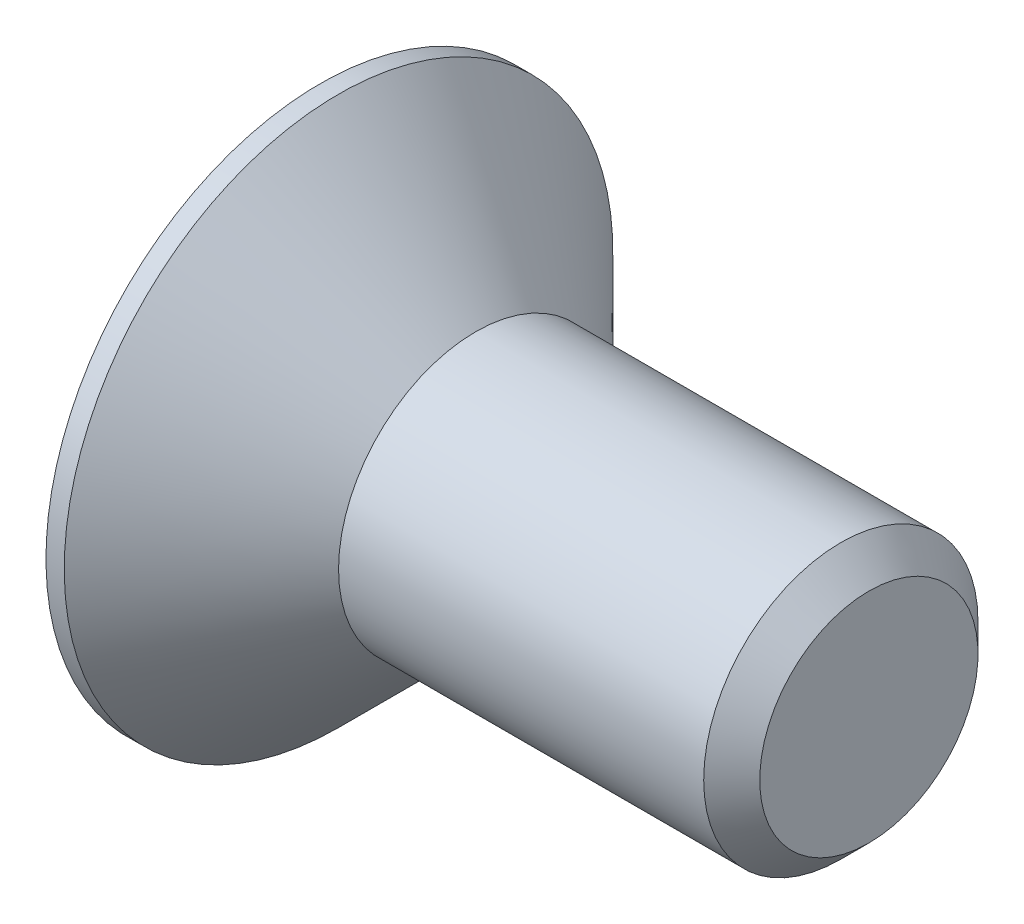
ISO-10303-21;
HEADER;
FILE_DESCRIPTION(('STEP AP214'),'2;1');
FILE_NAME('part.step','',(''),(''),'','','');
FILE_SCHEMA(('AUTOMOTIVE_DESIGN { 1 0 10303 214 1 1 1 1 }'));
ENDSEC;
DATA;
#1=APPLICATION_CONTEXT('core data for automotive mechanical design processes');
#2=APPLICATION_PROTOCOL_DEFINITION('international standard','automotive_design',2000,#1);
#3=PRODUCT_CONTEXT('',#1,'mechanical');
#4=PRODUCT('Part','Part','',(#3));
#5=PRODUCT_RELATED_PRODUCT_CATEGORY('part','',(#4));
#6=PRODUCT_DEFINITION_FORMATION('','',#4);
#7=PRODUCT_DEFINITION_CONTEXT('part definition',#1,'design');
#8=PRODUCT_DEFINITION('design','',#6,#7);
#9=PRODUCT_DEFINITION_SHAPE('','',#8);
#10=(LENGTH_UNIT() NAMED_UNIT(*) SI_UNIT(.MILLI.,.METRE.));
#11=(NAMED_UNIT(*) PLANE_ANGLE_UNIT() SI_UNIT($,.RADIAN.));
#12=(NAMED_UNIT(*) SI_UNIT($,.STERADIAN.) SOLID_ANGLE_UNIT());
#13=UNCERTAINTY_MEASURE_WITH_UNIT(LENGTH_MEASURE(1.E-05),#10,'distance_accuracy_value','');
#14=(GEOMETRIC_REPRESENTATION_CONTEXT(3) GLOBAL_UNCERTAINTY_ASSIGNED_CONTEXT((#13)) GLOBAL_UNIT_ASSIGNED_CONTEXT((#10,
#11,#12)) REPRESENTATION_CONTEXT('',''));
#15=CARTESIAN_POINT('',(0.,0.,0.));
#16=DIRECTION('',(0.,0.,1.));
#17=DIRECTION('',(1.,0.,0.));
#18=AXIS2_PLACEMENT_3D('',#15,#16,#17);
#19=CARTESIAN_POINT('',(-1.7,0.,0.));
#20=DIRECTION('',(1.,0.,0.));
#21=DIRECTION('',(0.,1.,0.));
#22=AXIS2_PLACEMENT_3D('',#19,#20,#21);
#23=PLANE('',#22);
#24=CARTESIAN_POINT('',(-1.7,0.,0.));
#25=DIRECTION('',(-1.,0.,0.));
#26=DIRECTION('',(0.,-1.,0.));
#27=AXIS2_PLACEMENT_3D('',#24,#25,#26);
#28=CIRCLE('',#27,3.);
#29=CARTESIAN_POINT('',(-1.7,-3.,0.));
#30=VERTEX_POINT('',#29);
#31=EDGE_CURVE('E11',#30,#30,#28,.T.);
#32=ORIENTED_EDGE('',*,*,#31,.T.);
#33=EDGE_LOOP('',(#32));
#34=FACE_BOUND('',#33,.T.);
#35=DIRECTION('',(0.,-0.500000000000029,-0.866025403784422));
#36=VECTOR('',#35,1.);
#37=CARTESIAN_POINT('',(-1.7,-0.57735026918963,1.));
#38=LINE('',#37,#36);
#39=CARTESIAN_POINT('',(-1.7,-0.57735026918963,1.));
#40=VERTEX_POINT('',#39);
#41=CARTESIAN_POINT('',(-1.7,-1.1547005383793,0.));
#42=VERTEX_POINT('',#41);
#43=EDGE_CURVE('E177',#40,#42,#38,.T.);
#44=ORIENTED_EDGE('',*,*,#43,.T.);
#45=DIRECTION('',(0.,0.500000000000029,-0.866025403784422));
#46=VECTOR('',#45,1.);
#47=CARTESIAN_POINT('',(-1.7,-1.1547005383793,0.));
#48=LINE('',#47,#46);
#49=CARTESIAN_POINT('',(-1.7,-0.57735026918963,-1.));
#50=VERTEX_POINT('',#49);
#51=EDGE_CURVE('E180',#42,#50,#48,.T.);
#52=ORIENTED_EDGE('',*,*,#51,.T.);
#53=DIRECTION('',(0.,1.,0.));
#54=VECTOR('',#53,1.);
#55=CARTESIAN_POINT('',(-1.7,-0.57735026918963,-1.));
#56=LINE('',#55,#54);
#57=CARTESIAN_POINT('',(-1.7,0.57735026918963,-1.));
#58=VERTEX_POINT('',#57);
#59=EDGE_CURVE('E192',#50,#58,#56,.T.);
#60=ORIENTED_EDGE('',*,*,#59,.T.);
#61=DIRECTION('',(0.,0.500000000000029,0.866025403784422));
#62=VECTOR('',#61,1.);
#63=CARTESIAN_POINT('',(-1.7,0.57735026918963,-1.));
#64=LINE('',#63,#62);
#65=CARTESIAN_POINT('',(-1.7,1.1547005383793,0.));
#66=VERTEX_POINT('',#65);
#67=EDGE_CURVE('E100',#58,#66,#64,.T.);
#68=ORIENTED_EDGE('',*,*,#67,.T.);
#69=DIRECTION('',(0.,-0.500000000000029,0.866025403784422));
#70=VECTOR('',#69,1.);
#71=CARTESIAN_POINT('',(-1.7,1.1547005383793,0.));
#72=LINE('',#71,#70);
#73=CARTESIAN_POINT('',(-1.7,0.57735026918963,1.));
#74=VERTEX_POINT('',#73);
#75=EDGE_CURVE('E216',#66,#74,#72,.T.);
#76=ORIENTED_EDGE('',*,*,#75,.T.);
#77=DIRECTION('',(0.,-1.,0.));
#78=VECTOR('',#77,1.);
#79=CARTESIAN_POINT('',(-1.7,0.57735026918963,1.));
#80=LINE('',#79,#78);
#81=EDGE_CURVE('E115',#74,#40,#80,.T.);
#82=ORIENTED_EDGE('',*,*,#81,.T.);
#83=EDGE_LOOP('',(#44,#52,#60,#68,#76,#82));
#84=FACE_BOUND('',#83,.T.);
#85=ADVANCED_FACE('F17',(#34,#84),#23,.F.);
#86=CARTESIAN_POINT('',(4.3,0.,0.));
#87=DIRECTION('',(-1.,0.,0.));
#88=DIRECTION('',(0.,-1.,0.));
#89=AXIS2_PLACEMENT_3D('',#86,#87,#88);
#90=CYLINDRICAL_SURFACE('',#89,3.);
#91=ORIENTED_EDGE('',*,*,#31,.F.);
#92=EDGE_LOOP('',(#91));
#93=FACE_BOUND('',#92,.T.);
#94=CARTESIAN_POINT('',(-1.5,0.,0.));
#95=DIRECTION('',(-1.,0.,0.));
#96=DIRECTION('',(0.,-1.,0.));
#97=AXIS2_PLACEMENT_3D('',#94,#95,#96);
#98=CIRCLE('',#97,3.);
#99=CARTESIAN_POINT('',(-1.5,-3.,0.));
#100=VERTEX_POINT('',#99);
#101=EDGE_CURVE('E24',#100,#100,#98,.T.);
#102=ORIENTED_EDGE('',*,*,#101,.T.);
#103=EDGE_LOOP('',(#102));
#104=FACE_BOUND('',#103,.T.);
#105=ADVANCED_FACE('F137',(#93,#104),#90,.T.);
#106=CARTESIAN_POINT('',(0.,0.,0.));
#107=DIRECTION('',(-1.,0.,0.));
#108=DIRECTION('',(0.,-1.,0.));
#109=AXIS2_PLACEMENT_3D('',#106,#107,#108);
#110=CONICAL_SURFACE('',#109,1.5,0.785398163397449);
#111=ORIENTED_EDGE('',*,*,#101,.F.);
#112=EDGE_LOOP('',(#111));
#113=FACE_BOUND('',#112,.T.);
#114=CARTESIAN_POINT('',(0.,0.,0.));
#115=DIRECTION('',(-1.,0.,0.));
#116=DIRECTION('',(0.,-1.,0.));
#117=AXIS2_PLACEMENT_3D('',#114,#115,#116);
#118=CIRCLE('',#117,1.5);
#119=CARTESIAN_POINT('',(0.,-1.5,0.));
#120=VERTEX_POINT('',#119);
#121=EDGE_CURVE('E132',#120,#120,#118,.T.);
#122=ORIENTED_EDGE('',*,*,#121,.T.);
#123=EDGE_LOOP('',(#122));
#124=FACE_BOUND('',#123,.T.);
#125=ADVANCED_FACE('F139',(#113,#124),#110,.T.);
#126=CARTESIAN_POINT('',(4.3,0.,0.));
#127=DIRECTION('',(-1.,0.,0.));
#128=DIRECTION('',(0.,-1.,0.));
#129=AXIS2_PLACEMENT_3D('',#126,#127,#128);
#130=CYLINDRICAL_SURFACE('',#129,1.5);
#131=ORIENTED_EDGE('',*,*,#121,.F.);
#132=EDGE_LOOP('',(#131));
#133=FACE_BOUND('',#132,.T.);
#134=CARTESIAN_POINT('',(3.9935,0.,0.));
#135=DIRECTION('',(-1.,0.,0.));
#136=DIRECTION('',(0.,-1.,0.));
#137=AXIS2_PLACEMENT_3D('',#134,#135,#136);
#138=CIRCLE('',#137,1.5);
#139=CARTESIAN_POINT('',(3.9935,-1.5,0.));
#140=VERTEX_POINT('',#139);
#141=EDGE_CURVE('E129',#140,#140,#138,.T.);
#142=ORIENTED_EDGE('',*,*,#141,.T.);
#143=EDGE_LOOP('',(#142));
#144=FACE_BOUND('',#143,.T.);
#145=ADVANCED_FACE('F142',(#133,#144),#130,.T.);
#146=CARTESIAN_POINT('',(4.3,0.,0.));
#147=DIRECTION('',(-1.,0.,0.));
#148=DIRECTION('',(0.,-1.,0.));
#149=AXIS2_PLACEMENT_3D('',#146,#147,#148);
#150=CONICAL_SURFACE('',#149,1.1935,0.785398163397446);
#151=ORIENTED_EDGE('',*,*,#141,.F.);
#152=EDGE_LOOP('',(#151));
#153=FACE_BOUND('',#152,.T.);
#154=CARTESIAN_POINT('',(4.3,0.,0.));
#155=DIRECTION('',(-1.,0.,0.));
#156=DIRECTION('',(0.,-1.,0.));
#157=AXIS2_PLACEMENT_3D('',#154,#155,#156);
#158=CIRCLE('',#157,1.1935);
#159=CARTESIAN_POINT('',(4.3,-1.1935,0.));
#160=VERTEX_POINT('',#159);
#161=EDGE_CURVE('E125',#160,#160,#158,.T.);
#162=ORIENTED_EDGE('',*,*,#161,.T.);
#163=EDGE_LOOP('',(#162));
#164=FACE_BOUND('',#163,.T.);
#165=ADVANCED_FACE('F148',(#153,#164),#150,.T.);
#166=CARTESIAN_POINT('',(4.3,1.1935,0.));
#167=DIRECTION('',(-1.,0.,0.));
#168=DIRECTION('',(0.,-1.,0.));
#169=AXIS2_PLACEMENT_3D('',#166,#167,#168);
#170=PLANE('',#169);
#171=ORIENTED_EDGE('',*,*,#161,.F.);
#172=EDGE_LOOP('',(#171));
#173=FACE_BOUND('',#172,.T.);
#174=ADVANCED_FACE('F154',(#173),#170,.F.);
#175=CARTESIAN_POINT('',(-0.85,1.1547005383793,0.));
#176=DIRECTION('',(0.,-0.866025403784422,-0.500000000000029));
#177=DIRECTION('',(0.,0.500000000000029,-0.866025403784422));
#178=AXIS2_PLACEMENT_3D('',#175,#176,#177);
#179=PLANE('',#178);
#180=DIRECTION('',(0.,-0.500000000000029,0.866025403784422));
#181=VECTOR('',#180,1.);
#182=CARTESIAN_POINT('',(-0.85,1.1547005383793,0.));
#183=LINE('',#182,#181);
#184=CARTESIAN_POINT('',(-0.85,1.1547005383793,0.));
#185=VERTEX_POINT('',#184);
#186=CARTESIAN_POINT('',(-0.85,0.866025403784442,0.50000000000004));
#187=VERTEX_POINT('',#186);
#188=EDGE_CURVE('E97',#185,#187,#183,.T.);
#189=ORIENTED_EDGE('',*,*,#188,.T.);
#190=CARTESIAN_POINT('',(-0.85,0.57735026918963,1.));
#191=VERTEX_POINT('',#190);
#192=EDGE_CURVE('E89',#187,#191,#183,.T.);
#193=ORIENTED_EDGE('',*,*,#192,.T.);
#194=DIRECTION('',(-1.,0.,0.));
#195=VECTOR('',#194,1.);
#196=CARTESIAN_POINT('',(-0.85,0.57735026918963,1.));
#197=LINE('',#196,#195);
#198=EDGE_CURVE('E94',#191,#74,#197,.T.);
#199=ORIENTED_EDGE('',*,*,#198,.T.);
#200=ORIENTED_EDGE('',*,*,#75,.F.);
#201=DIRECTION('',(-1.,0.,0.));
#202=VECTOR('',#201,1.);
#203=CARTESIAN_POINT('',(-0.85,1.1547005383793,0.));
#204=LINE('',#203,#202);
#205=EDGE_CURVE('E198',#185,#66,#204,.T.);
#206=ORIENTED_EDGE('',*,*,#205,.F.);
#207=EDGE_LOOP('',(#189,#193,#199,#200,#206));
#208=FACE_BOUND('',#207,.T.);
#209=ADVANCED_FACE('F91',(#208),#179,.T.);
#210=CARTESIAN_POINT('',(-0.85,0.57735026918963,1.));
#211=DIRECTION('',(0.,0.,-1.));
#212=DIRECTION('',(-1.,0.,0.));
#213=AXIS2_PLACEMENT_3D('',#210,#211,#212);
#214=PLANE('',#213);
#215=DIRECTION('',(0.,-1.,0.));
#216=VECTOR('',#215,1.);
#217=CARTESIAN_POINT('',(-0.85,0.57735026918963,1.));
#218=LINE('',#217,#216);
#219=CARTESIAN_POINT('',(-0.85,0.,1.));
#220=VERTEX_POINT('',#219);
#221=EDGE_CURVE('E103',#191,#220,#218,.T.);
#222=ORIENTED_EDGE('',*,*,#221,.T.);
#223=CARTESIAN_POINT('',(-0.85,-0.57735026918963,1.));
#224=VERTEX_POINT('',#223);
#225=EDGE_CURVE('E110',#220,#224,#218,.T.);
#226=ORIENTED_EDGE('',*,*,#225,.T.);
#227=DIRECTION('',(-1.,0.,0.));
#228=VECTOR('',#227,1.);
#229=CARTESIAN_POINT('',(-0.85,-0.57735026918963,1.));
#230=LINE('',#229,#228);
#231=EDGE_CURVE('E117',#224,#40,#230,.T.);
#232=ORIENTED_EDGE('',*,*,#231,.T.);
#233=ORIENTED_EDGE('',*,*,#81,.F.);
#234=ORIENTED_EDGE('',*,*,#198,.F.);
#235=EDGE_LOOP('',(#222,#226,#232,#233,#234));
#236=FACE_BOUND('',#235,.T.);
#237=ADVANCED_FACE('F113',(#236),#214,.T.);
#238=CARTESIAN_POINT('',(-0.85,-0.57735026918963,1.));
#239=DIRECTION('',(0.,0.866025403784422,-0.500000000000029));
#240=DIRECTION('',(0.,0.500000000000029,0.866025403784422));
#241=AXIS2_PLACEMENT_3D('',#238,#239,#240);
#242=PLANE('',#241);
#243=DIRECTION('',(0.,-0.500000000000029,-0.866025403784422));
#244=VECTOR('',#243,1.);
#245=CARTESIAN_POINT('',(-0.85,-0.57735026918963,1.));
#246=LINE('',#245,#244);
#247=CARTESIAN_POINT('',(-0.85,-0.866025403784442,0.50000000000004));
#248=VERTEX_POINT('',#247);
#249=EDGE_CURVE('E225',#224,#248,#246,.T.);
#250=ORIENTED_EDGE('',*,*,#249,.T.);
#251=CARTESIAN_POINT('',(-0.85,-1.1547005383793,0.));
#252=VERTEX_POINT('',#251);
#253=EDGE_CURVE('E109',#248,#252,#246,.T.);
#254=ORIENTED_EDGE('',*,*,#253,.T.);
#255=DIRECTION('',(-1.,0.,0.));
#256=VECTOR('',#255,1.);
#257=CARTESIAN_POINT('',(-0.85,-1.1547005383793,0.));
#258=LINE('',#257,#256);
#259=EDGE_CURVE('E121',#252,#42,#258,.T.);
#260=ORIENTED_EDGE('',*,*,#259,.T.);
#261=ORIENTED_EDGE('',*,*,#43,.F.);
#262=ORIENTED_EDGE('',*,*,#231,.F.);
#263=EDGE_LOOP('',(#250,#254,#260,#261,#262));
#264=FACE_BOUND('',#263,.T.);
#265=ADVANCED_FACE('F186',(#264),#242,.T.);
#266=CARTESIAN_POINT('',(-0.85,-1.1547005383793,0.));
#267=DIRECTION('',(0.,0.866025403784422,0.500000000000029));
#268=DIRECTION('',(0.,-0.500000000000029,0.866025403784422));
#269=AXIS2_PLACEMENT_3D('',#266,#267,#268);
#270=PLANE('',#269);
#271=DIRECTION('',(0.,0.500000000000029,-0.866025403784422));
#272=VECTOR('',#271,1.);
#273=CARTESIAN_POINT('',(-0.85,-1.1547005383793,0.));
#274=LINE('',#273,#272);
#275=CARTESIAN_POINT('',(-0.85,-0.866025403784422,-0.500000000000029));
#276=VERTEX_POINT('',#275);
#277=EDGE_CURVE('E31',#252,#276,#274,.T.);
#278=ORIENTED_EDGE('',*,*,#277,.T.);
#279=CARTESIAN_POINT('',(-0.85,-0.57735026918963,-1.));
#280=VERTEX_POINT('',#279);
#281=EDGE_CURVE('E224',#276,#280,#274,.T.);
#282=ORIENTED_EDGE('',*,*,#281,.T.);
#283=DIRECTION('',(-1.,0.,0.));
#284=VECTOR('',#283,1.);
#285=CARTESIAN_POINT('',(-0.85,-0.57735026918963,-1.));
#286=LINE('',#285,#284);
#287=EDGE_CURVE('E188',#280,#50,#286,.T.);
#288=ORIENTED_EDGE('',*,*,#287,.T.);
#289=ORIENTED_EDGE('',*,*,#51,.F.);
#290=ORIENTED_EDGE('',*,*,#259,.F.);
#291=EDGE_LOOP('',(#278,#282,#288,#289,#290));
#292=FACE_BOUND('',#291,.T.);
#293=ADVANCED_FACE('F189',(#292),#270,.T.);
#294=CARTESIAN_POINT('',(-0.85,-0.57735026918963,-1.));
#295=DIRECTION('',(0.,0.,1.));
#296=DIRECTION('',(1.,0.,0.));
#297=AXIS2_PLACEMENT_3D('',#294,#295,#296);
#298=PLANE('',#297);
#299=DIRECTION('',(0.,1.,0.));
#300=VECTOR('',#299,1.);
#301=CARTESIAN_POINT('',(-0.85,-0.57735026918963,-1.));
#302=LINE('',#301,#300);
#303=CARTESIAN_POINT('',(-0.85,0.,-1.));
#304=VERTEX_POINT('',#303);
#305=EDGE_CURVE('E221',#280,#304,#302,.T.);
#306=ORIENTED_EDGE('',*,*,#305,.T.);
#307=CARTESIAN_POINT('',(-0.85,0.57735026918963,-1.));
#308=VERTEX_POINT('',#307);
#309=EDGE_CURVE('E211',#304,#308,#302,.T.);
#310=ORIENTED_EDGE('',*,*,#309,.T.);
#311=DIRECTION('',(-1.,0.,0.));
#312=VECTOR('',#311,1.);
#313=CARTESIAN_POINT('',(-0.85,0.57735026918963,-1.));
#314=LINE('',#313,#312);
#315=EDGE_CURVE('E201',#308,#58,#314,.T.);
#316=ORIENTED_EDGE('',*,*,#315,.T.);
#317=ORIENTED_EDGE('',*,*,#59,.F.);
#318=ORIENTED_EDGE('',*,*,#287,.F.);
#319=EDGE_LOOP('',(#306,#310,#316,#317,#318));
#320=FACE_BOUND('',#319,.T.);
#321=ADVANCED_FACE('F209',(#320),#298,.T.);
#322=CARTESIAN_POINT('',(-0.85,0.57735026918963,-1.));
#323=DIRECTION('',(0.,-0.866025403784422,0.500000000000029));
#324=DIRECTION('',(0.,-0.500000000000029,-0.866025403784422));
#325=AXIS2_PLACEMENT_3D('',#322,#323,#324);
#326=PLANE('',#325);
#327=DIRECTION('',(0.,0.500000000000029,0.866025403784422));
#328=VECTOR('',#327,1.);
#329=CARTESIAN_POINT('',(-0.85,0.57735026918963,-1.));
#330=LINE('',#329,#328);
#331=CARTESIAN_POINT('',(-0.85,0.866025403784442,-0.50000000000004));
#332=VERTEX_POINT('',#331);
#333=EDGE_CURVE('E202',#308,#332,#330,.T.);
#334=ORIENTED_EDGE('',*,*,#333,.T.);
#335=EDGE_CURVE('E220',#332,#185,#330,.T.);
#336=ORIENTED_EDGE('',*,*,#335,.T.);
#337=ORIENTED_EDGE('',*,*,#205,.T.);
#338=ORIENTED_EDGE('',*,*,#67,.F.);
#339=ORIENTED_EDGE('',*,*,#315,.F.);
#340=EDGE_LOOP('',(#334,#336,#337,#338,#339));
#341=FACE_BOUND('',#340,.T.);
#342=ADVANCED_FACE('F215',(#341),#326,.T.);
#343=CARTESIAN_POINT('',(-0.85,0.57735026918963,1.));
#344=DIRECTION('',(1.,0.,0.));
#345=DIRECTION('',(0.,0.,-1.));
#346=AXIS2_PLACEMENT_3D('',#343,#344,#345);
#347=PLANE('',#346);
#348=CARTESIAN_POINT('',(-0.85,0.,0.));
#349=DIRECTION('',(-1.,0.,0.));
#350=DIRECTION('',(0.,0.,1.));
#351=AXIS2_PLACEMENT_3D('',#348,#349,#350);
#352=CIRCLE('',#351,1.);
#353=EDGE_CURVE('E239',#332,#304,#352,.T.);
#354=ORIENTED_EDGE('',*,*,#353,.F.);
#355=ORIENTED_EDGE('',*,*,#333,.F.);
#356=ORIENTED_EDGE('',*,*,#309,.F.);
#357=EDGE_LOOP('',(#354,#355,#356));
#358=FACE_BOUND('',#357,.T.);
#359=ADVANCED_FACE('F246',(#358),#347,.F.);
#360=EDGE_CURVE('E126',#187,#332,#352,.T.);
#361=ORIENTED_EDGE('',*,*,#360,.F.);
#362=ORIENTED_EDGE('',*,*,#188,.F.);
#363=ORIENTED_EDGE('',*,*,#335,.F.);
#364=EDGE_LOOP('',(#361,#362,#363));
#365=FACE_BOUND('',#364,.T.);
#366=ADVANCED_FACE('F244',(#365),#347,.F.);
#367=EDGE_CURVE('E105',#220,#187,#352,.T.);
#368=ORIENTED_EDGE('',*,*,#367,.F.);
#369=ORIENTED_EDGE('',*,*,#221,.F.);
#370=ORIENTED_EDGE('',*,*,#192,.F.);
#371=EDGE_LOOP('',(#368,#369,#370));
#372=FACE_BOUND('',#371,.T.);
#373=ADVANCED_FACE('F104',(#372),#347,.F.);
#374=EDGE_CURVE('E116',#248,#220,#352,.T.);
#375=ORIENTED_EDGE('',*,*,#374,.F.);
#376=ORIENTED_EDGE('',*,*,#249,.F.);
#377=ORIENTED_EDGE('',*,*,#225,.F.);
#378=EDGE_LOOP('',(#375,#376,#377));
#379=FACE_BOUND('',#378,.T.);
#380=ADVANCED_FACE('F229',(#379),#347,.F.);
#381=EDGE_CURVE('E119',#276,#248,#352,.T.);
#382=ORIENTED_EDGE('',*,*,#381,.F.);
#383=ORIENTED_EDGE('',*,*,#277,.F.);
#384=ORIENTED_EDGE('',*,*,#253,.F.);
#385=EDGE_LOOP('',(#382,#383,#384));
#386=FACE_BOUND('',#385,.T.);
#387=ADVANCED_FACE('F233',(#386),#347,.F.);
#388=EDGE_CURVE('E235',#304,#276,#352,.T.);
#389=ORIENTED_EDGE('',*,*,#388,.F.);
#390=ORIENTED_EDGE('',*,*,#305,.F.);
#391=ORIENTED_EDGE('',*,*,#281,.F.);
#392=EDGE_LOOP('',(#389,#390,#391));
#393=FACE_BOUND('',#392,.T.);
#394=ADVANCED_FACE('F247',(#393),#347,.F.);
#395=CARTESIAN_POINT('',(-0.58205080756888,0.,0.));
#396=DIRECTION('',(-1.,0.,0.));
#397=DIRECTION('',(0.,0.,1.));
#398=AXIS2_PLACEMENT_3D('',#395,#396,#397);
#399=CONICAL_SURFACE('',#398,0.,1.30899693899575);
#400=ORIENTED_EDGE('',*,*,#367,.T.);
#401=ORIENTED_EDGE('',*,*,#360,.T.);
#402=ORIENTED_EDGE('',*,*,#353,.T.);
#403=ORIENTED_EDGE('',*,*,#388,.T.);
#404=ORIENTED_EDGE('',*,*,#381,.T.);
#405=ORIENTED_EDGE('',*,*,#374,.T.);
#406=EDGE_LOOP('',(#400,#401,#402,#403,#404,#405));
#407=FACE_BOUND('',#406,.T.);
#408=CARTESIAN_POINT('',(-0.58205080756888,0.,0.));
#409=VERTEX_POINT('',#408);
#410=VERTEX_LOOP('',#409);
#411=FACE_BOUND('',#410,.T.);
#412=ADVANCED_FACE('F237',(#407,#411),#399,.F.);
#413=CLOSED_SHELL('',(#85,#105,#125,#145,#165,#174,#209,#237,#265,#293,#321,#342,#359,#366,#373,
#380,#387,#394,#412));
#414=MANIFOLD_SOLID_BREP('B1',#413);
#415=ADVANCED_BREP_SHAPE_REPRESENTATION('',(#18,#414),#14);
#416=SHAPE_DEFINITION_REPRESENTATION(#9,#415);
ENDSEC;
END-ISO-10303-21;
